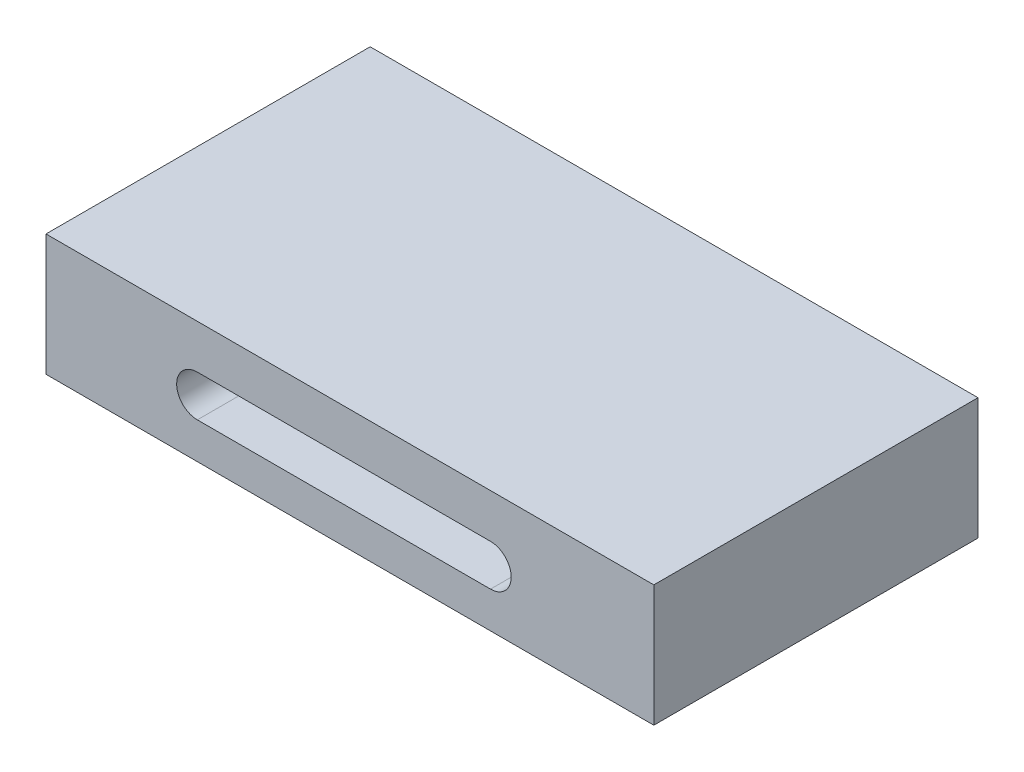
ISO-10303-21;
HEADER;
FILE_DESCRIPTION(('STEP AP214'),'2;1');
FILE_NAME('part.step','',(''),(''),'','','');
FILE_SCHEMA(('AUTOMOTIVE_DESIGN { 1 0 10303 214 1 1 1 1 }'));
ENDSEC;
DATA;
#1=APPLICATION_CONTEXT('core data for automotive mechanical design processes');
#2=APPLICATION_PROTOCOL_DEFINITION('international standard','automotive_design',2000,#1);
#3=PRODUCT_CONTEXT('',#1,'mechanical');
#4=PRODUCT('Part','Part','',(#3));
#5=PRODUCT_RELATED_PRODUCT_CATEGORY('part','',(#4));
#6=PRODUCT_DEFINITION_FORMATION('','',#4);
#7=PRODUCT_DEFINITION_CONTEXT('part definition',#1,'design');
#8=PRODUCT_DEFINITION('design','',#6,#7);
#9=PRODUCT_DEFINITION_SHAPE('','',#8);
#10=(LENGTH_UNIT() NAMED_UNIT(*) SI_UNIT(.MILLI.,.METRE.));
#11=(NAMED_UNIT(*) PLANE_ANGLE_UNIT() SI_UNIT($,.RADIAN.));
#12=(NAMED_UNIT(*) SI_UNIT($,.STERADIAN.) SOLID_ANGLE_UNIT());
#13=UNCERTAINTY_MEASURE_WITH_UNIT(LENGTH_MEASURE(1.E-05),#10,'distance_accuracy_value','');
#14=(GEOMETRIC_REPRESENTATION_CONTEXT(3) GLOBAL_UNCERTAINTY_ASSIGNED_CONTEXT((#13)) GLOBAL_UNIT_ASSIGNED_CONTEXT((#10,
#11,#12)) REPRESENTATION_CONTEXT('',''));
#15=CARTESIAN_POINT('',(0.,0.,0.));
#16=DIRECTION('',(0.,0.,1.));
#17=DIRECTION('',(1.,0.,0.));
#18=AXIS2_PLACEMENT_3D('',#15,#16,#17);
#19=CARTESIAN_POINT('',(0.,3.,0.));
#20=DIRECTION('',(-1.,0.,0.));
#21=DIRECTION('',(0.,0.,1.));
#22=AXIS2_PLACEMENT_3D('',#19,#20,#21);
#23=PLANE('',#22);
#24=DIRECTION('',(0.,0.,-1.));
#25=VECTOR('',#24,1.);
#26=CARTESIAN_POINT('',(0.,0.,0.));
#27=LINE('',#26,#25);
#28=CARTESIAN_POINT('',(0.,0.,0.));
#29=VERTEX_POINT('',#28);
#30=CARTESIAN_POINT('',(0.,0.,-8.00000000000001));
#31=VERTEX_POINT('',#30);
#32=EDGE_CURVE('E123',#29,#31,#27,.T.);
#33=ORIENTED_EDGE('',*,*,#32,.T.);
#34=DIRECTION('',(0.,-1.,0.));
#35=VECTOR('',#34,1.);
#36=CARTESIAN_POINT('',(0.,3.,-8.00000000000001));
#37=LINE('',#36,#35);
#38=CARTESIAN_POINT('',(0.,3.,-8.00000000000001));
#39=VERTEX_POINT('',#38);
#40=EDGE_CURVE('E152',#39,#31,#37,.T.);
#41=ORIENTED_EDGE('',*,*,#40,.F.);
#42=DIRECTION('',(0.,0.,-1.));
#43=VECTOR('',#42,1.);
#44=CARTESIAN_POINT('',(0.,3.,0.));
#45=LINE('',#44,#43);
#46=CARTESIAN_POINT('',(0.,3.,0.));
#47=VERTEX_POINT('',#46);
#48=EDGE_CURVE('E126',#47,#39,#45,.T.);
#49=ORIENTED_EDGE('',*,*,#48,.F.);
#50=DIRECTION('',(0.,-1.,0.));
#51=VECTOR('',#50,1.);
#52=CARTESIAN_POINT('',(0.,3.,0.));
#53=LINE('',#52,#51);
#54=EDGE_CURVE('E136',#47,#29,#53,.T.);
#55=ORIENTED_EDGE('',*,*,#54,.T.);
#56=EDGE_LOOP('',(#33,#41,#49,#55));
#57=FACE_BOUND('',#56,.T.);
#58=ADVANCED_FACE('F33',(#57),#23,.F.);
#59=CARTESIAN_POINT('',(0.,3.,-8.00000000000001));
#60=DIRECTION('',(0.,0.,1.));
#61=DIRECTION('',(1.,0.,0.));
#62=AXIS2_PLACEMENT_3D('',#59,#60,#61);
#63=PLANE('',#62);
#64=DIRECTION('',(1.,0.,0.));
#65=VECTOR('',#64,1.);
#66=CARTESIAN_POINT('',(-11.265287708568,1.91467587225702,-7.99999999999998));
#67=LINE('',#66,#65);
#68=CARTESIAN_POINT('',(-11.265287708568,1.91467587225702,-7.99999999999998));
#69=VERTEX_POINT('',#68);
#70=CARTESIAN_POINT('',(-4.03028425446907,1.91467587225702,-8.));
#71=VERTEX_POINT('',#70);
#72=EDGE_CURVE('E109',#69,#71,#67,.T.);
#73=ORIENTED_EDGE('',*,*,#72,.F.);
#74=CARTESIAN_POINT('',(-11.265287708568,1.40431027973875,-7.99999999999998));
#75=DIRECTION('',(0.,0.,-1.));
#76=DIRECTION('',(-1.,0.,0.));
#77=AXIS2_PLACEMENT_3D('',#74,#75,#76);
#78=CIRCLE('',#77,0.510365592518269);
#79=CARTESIAN_POINT('',(-11.265287708568,0.893944687220483,-7.99999999999998));
#80=VERTEX_POINT('',#79);
#81=EDGE_CURVE('E47',#80,#69,#78,.T.);
#82=ORIENTED_EDGE('',*,*,#81,.F.);
#83=DIRECTION('',(-1.,0.,0.));
#84=VECTOR('',#83,1.);
#85=CARTESIAN_POINT('',(-11.265287708568,0.893944687220483,-7.99999999999998));
#86=LINE('',#85,#84);
#87=CARTESIAN_POINT('',(-4.03028425446907,0.893944687220483,-8.));
#88=VERTEX_POINT('',#87);
#89=EDGE_CURVE('E116',#88,#80,#86,.T.);
#90=ORIENTED_EDGE('',*,*,#89,.F.);
#91=CARTESIAN_POINT('',(-4.03028425446907,1.40431027973875,-8.));
#92=DIRECTION('',(0.,0.,-1.));
#93=DIRECTION('',(-1.,0.,0.));
#94=AXIS2_PLACEMENT_3D('',#91,#92,#93);
#95=CIRCLE('',#94,0.510365592518269);
#96=EDGE_CURVE('E100',#71,#88,#95,.T.);
#97=ORIENTED_EDGE('',*,*,#96,.F.);
#98=EDGE_LOOP('',(#73,#82,#90,#97));
#99=FACE_BOUND('',#98,.T.);
#100=DIRECTION('',(-1.,0.,0.));
#101=VECTOR('',#100,1.);
#102=CARTESIAN_POINT('',(0.,0.,-8.00000000000001));
#103=LINE('',#102,#101);
#104=CARTESIAN_POINT('',(-15.,0.,-7.99999999999997));
#105=VERTEX_POINT('',#104);
#106=EDGE_CURVE('E139',#31,#105,#103,.T.);
#107=ORIENTED_EDGE('',*,*,#106,.T.);
#108=DIRECTION('',(0.,-1.,0.));
#109=VECTOR('',#108,1.);
#110=CARTESIAN_POINT('',(-15.,3.,-7.99999999999997));
#111=LINE('',#110,#109);
#112=CARTESIAN_POINT('',(-15.,3.,-7.99999999999997));
#113=VERTEX_POINT('',#112);
#114=EDGE_CURVE('E149',#113,#105,#111,.T.);
#115=ORIENTED_EDGE('',*,*,#114,.F.);
#116=DIRECTION('',(-1.,0.,0.));
#117=VECTOR('',#116,1.);
#118=CARTESIAN_POINT('',(0.,3.,-8.00000000000001));
#119=LINE('',#118,#117);
#120=EDGE_CURVE('E129',#39,#113,#119,.T.);
#121=ORIENTED_EDGE('',*,*,#120,.F.);
#122=ORIENTED_EDGE('',*,*,#40,.T.);
#123=EDGE_LOOP('',(#107,#115,#121,#122));
#124=FACE_BOUND('',#123,.T.);
#125=ADVANCED_FACE('F113',(#99,#124),#63,.F.);
#126=CARTESIAN_POINT('',(-15.,3.,0.));
#127=DIRECTION('',(1.,0.,0.));
#128=DIRECTION('',(0.,0.,-1.));
#129=AXIS2_PLACEMENT_3D('',#126,#127,#128);
#130=PLANE('',#129);
#131=DIRECTION('',(0.,0.,1.));
#132=VECTOR('',#131,1.);
#133=CARTESIAN_POINT('',(-15.,0.,0.));
#134=LINE('',#133,#132);
#135=CARTESIAN_POINT('',(-15.,0.,0.));
#136=VERTEX_POINT('',#135);
#137=EDGE_CURVE('E141',#105,#136,#134,.T.);
#138=ORIENTED_EDGE('',*,*,#137,.T.);
#139=DIRECTION('',(0.,-1.,0.));
#140=VECTOR('',#139,1.);
#141=CARTESIAN_POINT('',(-15.,3.,0.));
#142=LINE('',#141,#140);
#143=CARTESIAN_POINT('',(-15.,3.,0.));
#144=VERTEX_POINT('',#143);
#145=EDGE_CURVE('E146',#144,#136,#142,.T.);
#146=ORIENTED_EDGE('',*,*,#145,.F.);
#147=DIRECTION('',(0.,0.,1.));
#148=VECTOR('',#147,1.);
#149=CARTESIAN_POINT('',(-15.,3.,0.));
#150=LINE('',#149,#148);
#151=EDGE_CURVE('E132',#113,#144,#150,.T.);
#152=ORIENTED_EDGE('',*,*,#151,.F.);
#153=ORIENTED_EDGE('',*,*,#114,.T.);
#154=EDGE_LOOP('',(#138,#146,#152,#153));
#155=FACE_BOUND('',#154,.T.);
#156=ADVANCED_FACE('F183',(#155),#130,.F.);
#157=CARTESIAN_POINT('',(0.,3.,0.));
#158=DIRECTION('',(0.,0.,-1.));
#159=DIRECTION('',(-1.,0.,0.));
#160=AXIS2_PLACEMENT_3D('',#157,#158,#159);
#161=PLANE('',#160);
#162=DIRECTION('',(-1.,0.,0.));
#163=VECTOR('',#162,1.);
#164=CARTESIAN_POINT('',(0.,0.893944687220483,0.));
#165=LINE('',#164,#163);
#166=CARTESIAN_POINT('',(-4.03028425446905,0.893944687220483,0.));
#167=VERTEX_POINT('',#166);
#168=CARTESIAN_POINT('',(-11.2652877085679,0.893944687220483,0.));
#169=VERTEX_POINT('',#168);
#170=EDGE_CURVE('E40',#167,#169,#165,.T.);
#171=ORIENTED_EDGE('',*,*,#170,.T.);
#172=CARTESIAN_POINT('',(-11.2652877085679,1.40431027973875,0.));
#173=DIRECTION('',(0.,0.,-1.));
#174=DIRECTION('',(-1.,0.,0.));
#175=AXIS2_PLACEMENT_3D('',#172,#173,#174);
#176=CIRCLE('',#175,0.510365592518269);
#177=CARTESIAN_POINT('',(-11.2652877085679,1.91467587225702,0.));
#178=VERTEX_POINT('',#177);
#179=EDGE_CURVE('E11',#169,#178,#176,.T.);
#180=ORIENTED_EDGE('',*,*,#179,.T.);
#181=DIRECTION('',(1.,0.,0.));
#182=VECTOR('',#181,1.);
#183=CARTESIAN_POINT('',(0.,1.91467587225702,0.));
#184=LINE('',#183,#182);
#185=CARTESIAN_POINT('',(-4.03028425446904,1.91467587225702,0.));
#186=VERTEX_POINT('',#185);
#187=EDGE_CURVE('E155',#178,#186,#184,.T.);
#188=ORIENTED_EDGE('',*,*,#187,.T.);
#189=CARTESIAN_POINT('',(-4.03028425446905,1.40431027973875,0.));
#190=DIRECTION('',(0.,0.,-1.));
#191=DIRECTION('',(-1.,0.,0.));
#192=AXIS2_PLACEMENT_3D('',#189,#190,#191);
#193=CIRCLE('',#192,0.510365592518269);
#194=EDGE_CURVE('E103',#186,#167,#193,.T.);
#195=ORIENTED_EDGE('',*,*,#194,.T.);
#196=EDGE_LOOP('',(#171,#180,#188,#195));
#197=FACE_BOUND('',#196,.T.);
#198=DIRECTION('',(1.,0.,0.));
#199=VECTOR('',#198,1.);
#200=CARTESIAN_POINT('',(0.,0.,0.));
#201=LINE('',#200,#199);
#202=EDGE_CURVE('E130',#136,#29,#201,.T.);
#203=ORIENTED_EDGE('',*,*,#202,.T.);
#204=ORIENTED_EDGE('',*,*,#54,.F.);
#205=DIRECTION('',(1.,0.,0.));
#206=VECTOR('',#205,1.);
#207=CARTESIAN_POINT('',(0.,3.,0.));
#208=LINE('',#207,#206);
#209=EDGE_CURVE('E134',#144,#47,#208,.T.);
#210=ORIENTED_EDGE('',*,*,#209,.F.);
#211=ORIENTED_EDGE('',*,*,#145,.T.);
#212=EDGE_LOOP('',(#203,#204,#210,#211));
#213=FACE_BOUND('',#212,.T.);
#214=ADVANCED_FACE('F159',(#197,#213),#161,.F.);
#215=CARTESIAN_POINT('',(0.,3.,0.));
#216=DIRECTION('',(0.,1.,0.));
#217=DIRECTION('',(0.,0.,1.));
#218=AXIS2_PLACEMENT_3D('',#215,#216,#217);
#219=PLANE('',#218);
#220=ORIENTED_EDGE('',*,*,#48,.T.);
#221=ORIENTED_EDGE('',*,*,#120,.T.);
#222=ORIENTED_EDGE('',*,*,#151,.T.);
#223=ORIENTED_EDGE('',*,*,#209,.T.);
#224=EDGE_LOOP('',(#220,#221,#222,#223));
#225=FACE_BOUND('',#224,.T.);
#226=ADVANCED_FACE('F173',(#225),#219,.T.);
#227=CARTESIAN_POINT('',(0.,0.,0.));
#228=DIRECTION('',(0.,1.,0.));
#229=DIRECTION('',(0.,0.,1.));
#230=AXIS2_PLACEMENT_3D('',#227,#228,#229);
#231=PLANE('',#230);
#232=ORIENTED_EDGE('',*,*,#32,.F.);
#233=ORIENTED_EDGE('',*,*,#202,.F.);
#234=ORIENTED_EDGE('',*,*,#137,.F.);
#235=ORIENTED_EDGE('',*,*,#106,.F.);
#236=EDGE_LOOP('',(#232,#233,#234,#235));
#237=FACE_BOUND('',#236,.T.);
#238=ADVANCED_FACE('F166',(#237),#231,.F.);
#239=CARTESIAN_POINT('',(-11.2652877085679,1.40431027973875,5.00000000000002));
#240=DIRECTION('',(0.,0.,-1.));
#241=DIRECTION('',(-1.,0.,0.));
#242=AXIS2_PLACEMENT_3D('',#239,#240,#241);
#243=CYLINDRICAL_SURFACE('',#242,0.510365592518269);
#244=DIRECTION('',(0.,0.,-1.));
#245=VECTOR('',#244,1.);
#246=CARTESIAN_POINT('',(-11.2652877085679,0.893944687220483,5.00000000000002));
#247=LINE('',#246,#245);
#248=EDGE_CURVE('E121',#169,#80,#247,.T.);
#249=ORIENTED_EDGE('',*,*,#248,.T.);
#250=ORIENTED_EDGE('',*,*,#81,.T.);
#251=DIRECTION('',(0.,0.,-1.));
#252=VECTOR('',#251,1.);
#253=CARTESIAN_POINT('',(-11.2652877085679,1.91467587225702,5.00000000000002));
#254=LINE('',#253,#252);
#255=EDGE_CURVE('E106',#178,#69,#254,.T.);
#256=ORIENTED_EDGE('',*,*,#255,.F.);
#257=ORIENTED_EDGE('',*,*,#179,.F.);
#258=EDGE_LOOP('',(#249,#250,#256,#257));
#259=FACE_BOUND('',#258,.T.);
#260=ADVANCED_FACE('F164',(#259),#243,.F.);
#261=CARTESIAN_POINT('',(-11.2652877085679,0.893944687220483,5.00000000000002));
#262=DIRECTION('',(0.,-1.,0.));
#263=DIRECTION('',(0.,0.,-1.));
#264=AXIS2_PLACEMENT_3D('',#261,#262,#263);
#265=PLANE('',#264);
#266=DIRECTION('',(0.,0.,-1.));
#267=VECTOR('',#266,1.);
#268=CARTESIAN_POINT('',(-4.03028425446904,0.893944687220483,5.));
#269=LINE('',#268,#267);
#270=EDGE_CURVE('E105',#167,#88,#269,.T.);
#271=ORIENTED_EDGE('',*,*,#270,.T.);
#272=ORIENTED_EDGE('',*,*,#89,.T.);
#273=ORIENTED_EDGE('',*,*,#248,.F.);
#274=ORIENTED_EDGE('',*,*,#170,.F.);
#275=EDGE_LOOP('',(#271,#272,#273,#274));
#276=FACE_BOUND('',#275,.T.);
#277=ADVANCED_FACE('F163',(#276),#265,.F.);
#278=CARTESIAN_POINT('',(-4.03028425446904,1.40431027973875,5.));
#279=DIRECTION('',(0.,0.,-1.));
#280=DIRECTION('',(-1.,0.,0.));
#281=AXIS2_PLACEMENT_3D('',#278,#279,#280);
#282=CYLINDRICAL_SURFACE('',#281,0.510365592518269);
#283=DIRECTION('',(0.,0.,-1.));
#284=VECTOR('',#283,1.);
#285=CARTESIAN_POINT('',(-4.03028425446904,1.91467587225702,5.));
#286=LINE('',#285,#284);
#287=EDGE_CURVE('E55',#186,#71,#286,.T.);
#288=ORIENTED_EDGE('',*,*,#287,.T.);
#289=ORIENTED_EDGE('',*,*,#96,.T.);
#290=ORIENTED_EDGE('',*,*,#270,.F.);
#291=ORIENTED_EDGE('',*,*,#194,.F.);
#292=EDGE_LOOP('',(#288,#289,#290,#291));
#293=FACE_BOUND('',#292,.T.);
#294=ADVANCED_FACE('F97',(#293),#282,.F.);
#295=CARTESIAN_POINT('',(-11.2652877085679,1.91467587225702,5.00000000000002));
#296=DIRECTION('',(0.,1.,0.));
#297=DIRECTION('',(0.,0.,1.));
#298=AXIS2_PLACEMENT_3D('',#295,#296,#297);
#299=PLANE('',#298);
#300=ORIENTED_EDGE('',*,*,#255,.T.);
#301=ORIENTED_EDGE('',*,*,#72,.T.);
#302=ORIENTED_EDGE('',*,*,#287,.F.);
#303=ORIENTED_EDGE('',*,*,#187,.F.);
#304=EDGE_LOOP('',(#300,#301,#302,#303));
#305=FACE_BOUND('',#304,.T.);
#306=ADVANCED_FACE('F110',(#305),#299,.F.);
#307=CLOSED_SHELL('',(#58,#125,#156,#214,#226,#238,#260,#277,#294,#306));
#308=MANIFOLD_SOLID_BREP('B2',#307);
#309=ADVANCED_BREP_SHAPE_REPRESENTATION('',(#18,#308),#14);
#310=SHAPE_DEFINITION_REPRESENTATION(#9,#309);
ENDSEC;
END-ISO-10303-21;
